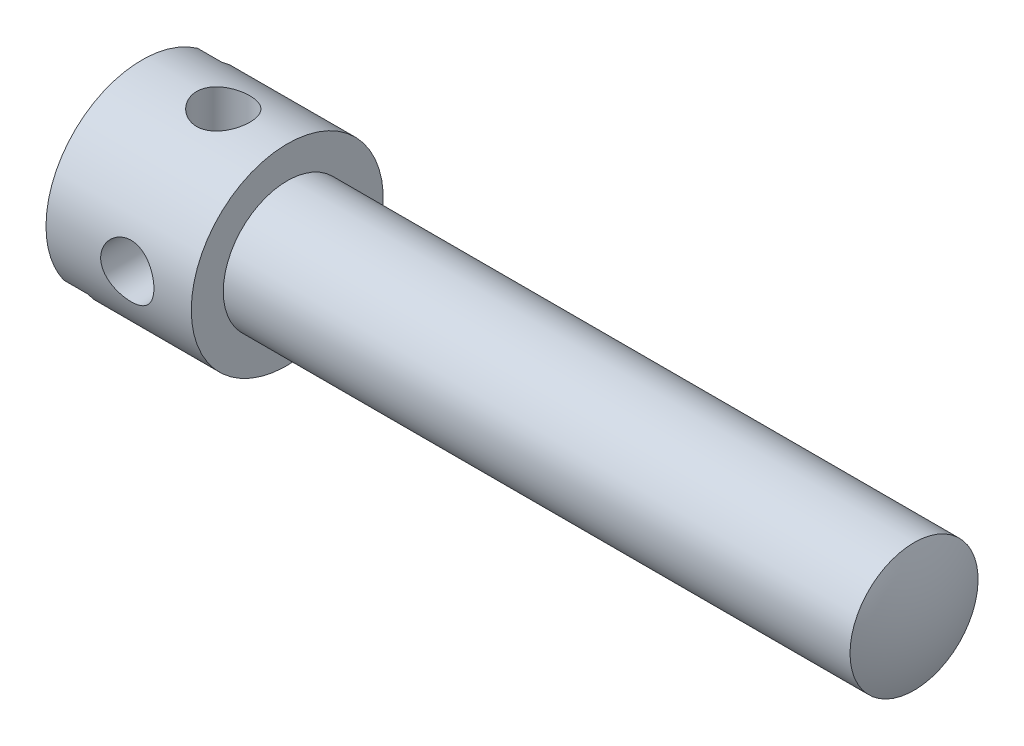
ISO-10303-21;
HEADER;
FILE_DESCRIPTION(('STEP AP214'),'2;1');
FILE_NAME('part.step','',(''),(''),'','','');
FILE_SCHEMA(('AUTOMOTIVE_DESIGN { 1 0 10303 214 1 1 1 1 }'));
ENDSEC;
DATA;
#1=APPLICATION_CONTEXT('core data for automotive mechanical design processes');
#2=APPLICATION_PROTOCOL_DEFINITION('international standard','automotive_design',2000,#1);
#3=PRODUCT_CONTEXT('',#1,'mechanical');
#4=PRODUCT('Part','Part','',(#3));
#5=PRODUCT_RELATED_PRODUCT_CATEGORY('part','',(#4));
#6=PRODUCT_DEFINITION_FORMATION('','',#4);
#7=PRODUCT_DEFINITION_CONTEXT('part definition',#1,'design');
#8=PRODUCT_DEFINITION('design','',#6,#7);
#9=PRODUCT_DEFINITION_SHAPE('','',#8);
#10=(LENGTH_UNIT() NAMED_UNIT(*) SI_UNIT(.MILLI.,.METRE.));
#11=(NAMED_UNIT(*) PLANE_ANGLE_UNIT() SI_UNIT($,.RADIAN.));
#12=(NAMED_UNIT(*) SI_UNIT($,.STERADIAN.) SOLID_ANGLE_UNIT());
#13=UNCERTAINTY_MEASURE_WITH_UNIT(LENGTH_MEASURE(1.E-05),#10,'distance_accuracy_value','');
#14=(GEOMETRIC_REPRESENTATION_CONTEXT(3) GLOBAL_UNCERTAINTY_ASSIGNED_CONTEXT((#13)) GLOBAL_UNIT_ASSIGNED_CONTEXT((#10,
#11,#12)) REPRESENTATION_CONTEXT('',''));
#15=CARTESIAN_POINT('',(0.,0.,0.));
#16=DIRECTION('',(0.,0.,1.));
#17=DIRECTION('',(1.,0.,0.));
#18=AXIS2_PLACEMENT_3D('',#15,#16,#17);
#19=CARTESIAN_POINT('',(18.4412641214728,-20.6545160380885,-24.3161484121018));
#20=DIRECTION('',(-1.,0.,0.));
#21=DIRECTION('',(0.,1.,0.));
#22=AXIS2_PLACEMENT_3D('',#19,#20,#21);
#23=SPHERICAL_SURFACE('',#22,25.);
#24=CARTESIAN_POINT('',(-5.40721591395087,-20.6545160380885,-24.3161484121018));
#25=DIRECTION('',(-1.,0.,0.));
#26=DIRECTION('',(0.,0.,1.));
#27=AXIS2_PLACEMENT_3D('',#24,#25,#26);
#28=CIRCLE('',#27,7.5);
#29=CARTESIAN_POINT('',(-5.40721591395087,-24.9997577274433,-18.2031397697807));
#30=VERTEX_POINT('',#29);
#31=CARTESIAN_POINT('',(-5.40721591395087,-14.5415073957673,-28.6613901014566));
#32=VERTEX_POINT('',#31);
#33=EDGE_CURVE('E157',#30,#32,#28,.T.);
#34=ORIENTED_EDGE('',*,*,#33,.T.);
#35=CARTESIAN_POINT('',(18.4412641214728,-19.7706325616053,-23.4322649356187));
#36=DIRECTION('',(0.,0.707106781186546,0.707106781186549));
#37=DIRECTION('',(0.,-0.707106781186549,0.707106781186546));
#38=AXIS2_PLACEMENT_3D('',#35,#36,#37);
#39=CIRCLE('',#38,24.9687304442977);
#40=EDGE_CURVE('E183',#32,#30,#39,.T.);
#41=ORIENTED_EDGE('',*,*,#40,.T.);
#42=EDGE_LOOP('',(#34,#41));
#43=FACE_BOUND('',#42,.T.);
#44=ADVANCED_FACE('F16',(#43),#23,.T.);
#45=CARTESIAN_POINT('',(0.941264121472774,-20.6545160380885,-94.3161484121019));
#46=DIRECTION('',(0.,0.,1.));
#47=DIRECTION('',(1.,0.,0.));
#48=AXIS2_PLACEMENT_3D('',#45,#46,#47);
#49=CYLINDRICAL_SURFACE('',#48,2.08);
#50=CARTESIAN_POINT('',(3.02126412147278,-20.6545160380885,-16.8161484121018));
#51=CARTESIAN_POINT('',(3.02126177590004,-20.7690086236511,-16.8161499515265));
#52=CARTESIAN_POINT('',(3.01177923896114,-20.8835257379495,-16.8187957006833));
#53=CARTESIAN_POINT('',(2.97417376740308,-21.109249871873,-16.829092733525));
#54=CARTESIAN_POINT('',(2.94604292402895,-21.2204554661633,-16.8367461409421));
#55=CARTESIAN_POINT('',(2.87213416634286,-21.43626654836,-16.856215630163));
#56=CARTESIAN_POINT('',(2.82638003298838,-21.5408807103721,-16.8680261005619));
#57=CARTESIAN_POINT('',(2.71861457996792,-21.7409514290536,-16.8945679722853));
#58=CARTESIAN_POINT('',(2.65660183134148,-21.8364071797877,-16.9092996303235));
#59=CARTESIAN_POINT('',(2.51644964772598,-22.0178288684621,-16.9405095366327));
#60=CARTESIAN_POINT('',(2.43798001518153,-22.1035342610594,-16.9570195228972));
#61=CARTESIAN_POINT('',(2.2678466998338,-22.2607532444289,-16.9897260938316));
#62=CARTESIAN_POINT('',(2.17618117061734,-22.3322648458228,-17.0059226342826));
#63=CARTESIAN_POINT('',(1.98014013481642,-22.4603673345642,-17.0364964543352));
#64=CARTESIAN_POINT('',(1.87555831451246,-22.5166528851236,-17.0508338690581));
#65=CARTESIAN_POINT('',(1.65795325101979,-22.6107367006983,-17.0755970401217));
#66=CARTESIAN_POINT('',(1.54493171186035,-22.6485386860835,-17.0860235835436));
#67=CARTESIAN_POINT('',(1.31655399339066,-22.7036667304692,-17.1014558504845));
#68=CARTESIAN_POINT('',(1.2013211455622,-22.7214677032227,-17.106587056268));
#69=CARTESIAN_POINT('',(0.96939921570726,-22.7375698314153,-17.1112221012764));
#70=CARTESIAN_POINT('',(0.852710434860466,-22.7358749551596,-17.1107270856972));
#71=CARTESIAN_POINT('',(0.624942367606029,-22.7134092831929,-17.1042775930327));
#72=CARTESIAN_POINT('',(0.513800335441755,-22.6932192334796,-17.0984893325936));
#73=CARTESIAN_POINT('',(0.296546795613579,-22.6352689830067,-17.082372533008));
#74=CARTESIAN_POINT('',(0.190435720001149,-22.5975072762186,-17.0720436046949));
#75=CARTESIAN_POINT('',(-0.0152286417802784,-22.5050266552738,-17.0478673473454));
#76=CARTESIAN_POINT('',(-0.114687503236666,-22.4501088973334,-17.0339791228886));
#77=CARTESIAN_POINT('',(-0.303179236937562,-22.325013616789,-17.0042703848697));
#78=CARTESIAN_POINT('',(-0.392209901172212,-22.2548328714368,-16.9884494635323));
#79=CARTESIAN_POINT('',(-0.560628897515607,-22.0982605600354,-16.9559715026925));
#80=CARTESIAN_POINT('',(-0.639564229408043,-22.0113830137847,-16.9393046923917));
#81=CARTESIAN_POINT('',(-0.781842002837752,-21.8254182337483,-16.9075133429213));
#82=CARTESIAN_POINT('',(-0.845183726460598,-21.7263304381296,-16.8923888747783));
#83=CARTESIAN_POINT('',(-0.954698486105356,-21.5180190640235,-16.8652803376592));
#84=CARTESIAN_POINT('',(-1.00078386926216,-21.4087471678016,-16.8533123905577));
#85=CARTESIAN_POINT('',(-1.07379647898204,-21.1835976532909,-16.8339816430555));
#86=CARTESIAN_POINT('',(-1.10072824560017,-21.0677216074476,-16.8266177513881));
#87=CARTESIAN_POINT('',(-1.13394470949133,-20.8365144188756,-16.8174922098312));
#88=CARTESIAN_POINT('',(-1.14084466715134,-20.7212781202203,-16.8155636735829));
#89=CARTESIAN_POINT('',(-1.13550858144867,-20.49129287593,-16.8170433117953));
#90=CARTESIAN_POINT('',(-1.12327469059708,-20.376543876931,-16.8204508859568));
#91=CARTESIAN_POINT('',(-1.08052086712382,-20.1530253886565,-16.8321115698254));
#92=CARTESIAN_POINT('',(-1.05034914548997,-20.0441840317668,-16.8402723500504));
#93=CARTESIAN_POINT('',(-0.972984959854057,-19.8331220520663,-16.8605087879622));
#94=CARTESIAN_POINT('',(-0.92579057924099,-19.7309021763089,-16.872584886466));
#95=CARTESIAN_POINT('',(-0.81461337802237,-19.5336329625004,-16.8996972389499));
#96=CARTESIAN_POINT('',(-0.750302508580325,-19.4387764319528,-16.9147897181063));
#97=CARTESIAN_POINT('',(-0.607125872691986,-19.2609873415236,-16.9461930504006));
#98=CARTESIAN_POINT('',(-0.528256989500167,-19.1780573417865,-16.9625041639916));
#99=CARTESIAN_POINT('',(-0.355324216074324,-19.0238457430361,-16.9951289235312));
#100=CARTESIAN_POINT('',(-0.260868357565123,-18.9529996110393,-17.0114272920354));
#101=CARTESIAN_POINT('',(-0.0610597553747219,-18.8281475215476,-17.0416367735864));
#102=CARTESIAN_POINT('',(0.0442925695019124,-18.7741409171473,-17.0555479783288));
#103=CARTESIAN_POINT('',(0.262421508213741,-18.684902820603,-17.0792459676892));
#104=CARTESIAN_POINT('',(0.375152779130467,-18.6495669044151,-17.0890556262014));
#105=CARTESIAN_POINT('',(0.605279295419787,-18.5984526739112,-17.103428959453));
#106=CARTESIAN_POINT('',(0.722673218786488,-18.5826688562524,-17.1079941103413));
#107=CARTESIAN_POINT('',(0.954315012126939,-18.5714419679624,-17.111231226315));
#108=CARTESIAN_POINT('',(1.0685264637457,-18.5752961091754,-17.1101068152461));
#109=CARTESIAN_POINT('',(1.29460262444287,-18.6015909032817,-17.1025722182843));
#110=CARTESIAN_POINT('',(1.40646740344937,-18.6240310015263,-17.0961621901265));
#111=CARTESIAN_POINT('',(1.62370916815238,-18.6864382979099,-17.0789047458977));
#112=CARTESIAN_POINT('',(1.72913568522314,-18.726245122869,-17.0680979916089));
#113=CARTESIAN_POINT('',(1.93189563853875,-18.8221318516948,-17.0432665893176));
#114=CARTESIAN_POINT('',(2.02922770969266,-18.8782144932717,-17.0292414000341));
#115=CARTESIAN_POINT('',(2.2163620842298,-19.0071422773394,-16.9989994505238));
#116=CARTESIAN_POINT('',(2.30582887745986,-19.0804614776606,-16.9827274056449));
#117=CARTESIAN_POINT('',(2.47141723692376,-19.2408945038974,-16.9501207367929));
#118=CARTESIAN_POINT('',(2.5475354921062,-19.3280117421913,-16.9337860983175));
#119=CARTESIAN_POINT('',(2.68604836463978,-19.516059145628,-16.9024311525418));
#120=CARTESIAN_POINT('',(2.74807481842464,-19.617267832795,-16.8874511889928));
#121=CARTESIAN_POINT('',(2.85413710561393,-19.8290905385424,-16.8609467267677));
#122=CARTESIAN_POINT('',(2.89818354692715,-19.9396989647544,-16.8494201916971));
#123=CARTESIAN_POINT('',(2.9618345955532,-20.1505341481245,-16.8324652621201));
#124=CARTESIAN_POINT('',(2.98406635965395,-20.2499235410374,-16.8263928185065));
#125=CARTESIAN_POINT('',(3.01378130077447,-20.4510410284306,-16.8182339429966));
#126=CARTESIAN_POINT('',(3.02126620593472,-20.5527688474641,-16.8161470440471));
#127=CARTESIAN_POINT('',(3.02126412147278,-20.6545160380885,-16.8161484121018));
#128=B_SPLINE_CURVE_WITH_KNOTS('',3,(#50,#51,#52,#53,#54,#55,#56,#57,#58,#59,#60,#61,#62,#63,
#64,#65,#66,#67,#68,#69,#70,#71,#72,#73,#74,#75,#76,#77,#78,#79,#80,#81,#82,#83,#84,#85,#86,#87,
#88,#89,#90,#91,#92,#93,#94,#95,#96,#97,#98,#99,#100,#101,#102,#103,#104,#105,#106,#107,#108,
#109,#110,#111,#112,#113,#114,#115,#116,#117,#118,#119,#120,#121,#122,#123,#124,#125,#126,#127),
.UNSPECIFIED.,.T.,.F.,(4,2,2,2,2,2,2,2,2,2,2,2,2,2,2,2,2,2,2,2,2,2,2,2,2,2,2,2,2,2,2,2,2,2,2,2,
2,2,4),(0.,0.34310443908677,0.686354482087734,1.02914295531318,1.37196156612794,
1.72246124768001,2.07301002005284,2.43014019625182,2.78719845970775,3.13558652051187,
3.48390366951812,3.82164520402484,4.15941569095652,4.50125615500133,4.84316886814917,
5.19718726379688,5.55122195505748,5.90703131178064,6.2627563015151,6.60743352062554,
6.952071967182,7.29022919864282,7.62842451571002,7.973637587138,8.31892465161763,
8.67480584923735,9.0306733736791,9.38452890097728,9.73828480566868,10.0794716415118,
10.420648295904,10.7587389182021,11.0968864427835,11.4457287596568,11.7946574834541,
12.1518590086101,12.5088494851444,12.8137950351805,13.1187048474299),.UNSPECIFIED.);
#129=CARTESIAN_POINT('',(3.02126412147278,-20.6545160380885,-16.8161484121018));
#130=VERTEX_POINT('',#129);
#131=EDGE_CURVE('E105',#130,#130,#128,.T.);
#132=ORIENTED_EDGE('',*,*,#131,.F.);
#133=EDGE_LOOP('',(#132));
#134=FACE_BOUND('',#133,.T.);
#135=CARTESIAN_POINT('',(0.941264121472774,-20.6545160380885,-24.3161484121018));
#136=DIRECTION('',(0.,-0.707106781186547,0.707106781186547));
#137=DIRECTION('',(0.,0.707106781186547,0.707106781186547));
#138=AXIS2_PLACEMENT_3D('',#135,#136,#137);
#139=ELLIPSE('',#138,2.94156420973604,2.08);
#140=CARTESIAN_POINT('',(-1.13873587852723,-20.6545160380885,-24.3161484121018));
#141=VERTEX_POINT('',#140);
#142=CARTESIAN_POINT('',(3.02126412147278,-20.6545160380885,-24.3161484121018));
#143=VERTEX_POINT('',#142);
#144=EDGE_CURVE('E36',#141,#143,#139,.F.);
#145=ORIENTED_EDGE('',*,*,#144,.T.);
#146=CARTESIAN_POINT('',(0.941264121472774,-20.6545160380885,-24.3161484121018));
#147=DIRECTION('',(0.,0.707106781186547,0.707106781186547));
#148=DIRECTION('',(0.,-0.707106781186547,0.707106781186547));
#149=AXIS2_PLACEMENT_3D('',#146,#147,#148);
#150=ELLIPSE('',#149,2.94156420973604,2.08);
#151=EDGE_CURVE('E93',#143,#141,#150,.F.);
#152=ORIENTED_EDGE('',*,*,#151,.T.);
#153=EDGE_LOOP('',(#145,#152));
#154=FACE_BOUND('',#153,.T.);
#155=ADVANCED_FACE('F130',(#134,#154),#49,.F.);
#156=CARTESIAN_POINT('',(5.94126412147277,-13.1545160380885,-24.3161484121018));
#157=DIRECTION('',(-1.,0.,0.));
#158=DIRECTION('',(0.,0.,1.));
#159=AXIS2_PLACEMENT_3D('',#156,#157,#158);
#160=PLANE('',#159);
#161=CARTESIAN_POINT('',(5.94126412147277,-20.6545160380885,-24.3161484121018));
#162=DIRECTION('',(-1.,0.,0.));
#163=DIRECTION('',(0.,0.,1.));
#164=AXIS2_PLACEMENT_3D('',#161,#162,#163);
#165=CIRCLE('',#164,7.5);
#166=CARTESIAN_POINT('',(5.94126412147277,-20.6545160380885,-16.8161484121018));
#167=VERTEX_POINT('',#166);
#168=EDGE_CURVE('E158',#167,#167,#165,.T.);
#169=ORIENTED_EDGE('',*,*,#168,.F.);
#170=EDGE_LOOP('',(#169));
#171=FACE_BOUND('',#170,.T.);
#172=CARTESIAN_POINT('',(5.94126412147277,-20.6545160380885,-24.3161484121018));
#173=DIRECTION('',(-1.,0.,0.));
#174=DIRECTION('',(0.,0.,1.));
#175=AXIS2_PLACEMENT_3D('',#172,#173,#174);
#176=CIRCLE('',#175,5.);
#177=CARTESIAN_POINT('',(5.94126412147277,-20.6545160380885,-19.3161484121018));
#178=VERTEX_POINT('',#177);
#179=EDGE_CURVE('E101',#178,#178,#176,.F.);
#180=ORIENTED_EDGE('',*,*,#179,.F.);
#181=EDGE_LOOP('',(#180));
#182=FACE_BOUND('',#181,.T.);
#183=ADVANCED_FACE('F146',(#171,#182),#160,.F.);
#184=CARTESIAN_POINT('',(-5.40721591395087,-16.3092743487337,-30.429157054423));
#185=VERTEX_POINT('',#184);
#186=CARTESIAN_POINT('',(-5.40721591395087,-26.7675246804096,-19.9709067227471));
#187=VERTEX_POINT('',#186);
#188=EDGE_CURVE('E160',#185,#187,#28,.T.);
#189=ORIENTED_EDGE('',*,*,#188,.T.);
#190=CARTESIAN_POINT('',(18.4412641214728,-21.5383995145717,-25.200031888585));
#191=DIRECTION('',(0.,-0.707106781186546,-0.707106781186549));
#192=DIRECTION('',(0.,0.707106781186549,-0.707106781186546));
#193=AXIS2_PLACEMENT_3D('',#190,#191,#192);
#194=CIRCLE('',#193,24.9687304442977);
#195=EDGE_CURVE('E67',#187,#185,#194,.T.);
#196=ORIENTED_EDGE('',*,*,#195,.T.);
#197=EDGE_LOOP('',(#189,#196));
#198=FACE_BOUND('',#197,.T.);
#199=ADVANCED_FACE('F18',(#198),#23,.T.);
#200=CARTESIAN_POINT('',(-31.6182793740149,-20.6545160380885,-24.3161484121018));
#201=DIRECTION('',(-1.,0.,0.));
#202=DIRECTION('',(0.,0.,1.));
#203=AXIS2_PLACEMENT_3D('',#200,#201,#202);
#204=CYLINDRICAL_SURFACE('',#203,7.5);
#205=CARTESIAN_POINT('',(0.941264121472774,-27.8603192549409,-22.2361484121018));
#206=CARTESIAN_POINT('',(1.05566117933701,-27.8603210464082,-22.2361507999992));
#207=CARTESIAN_POINT('',(1.17008284070807,-27.8630732471144,-22.2456180703913));
#208=CARTESIAN_POINT('',(1.39560909584565,-27.8737484245418,-22.2831574150593));
#209=CARTESIAN_POINT('',(1.50671217728147,-27.8816737222352,-22.3112378404388));
#210=CARTESIAN_POINT('',(1.72230564641116,-27.9017299881532,-22.3849993002082));
#211=CARTESIAN_POINT('',(1.82680558303251,-27.9138547109236,-22.4306542087086));
#212=CARTESIAN_POINT('',(2.02668225604302,-27.9409355692136,-22.5381854679922));
#213=CARTESIAN_POINT('',(2.12205807330961,-27.9558919895344,-22.6000634506711));
#214=CARTESIAN_POINT('',(2.30355870742098,-27.9874044707085,-22.7400747643598));
#215=CARTESIAN_POINT('',(2.38940019955647,-28.0039907093889,-22.8185686636573));
#216=CARTESIAN_POINT('',(2.54688505605188,-28.0366343523105,-22.9888090275393));
#217=CARTESIAN_POINT('',(2.618526845203,-28.0526916977157,-23.0805569604776));
#218=CARTESIAN_POINT('',(2.74677509186661,-28.0828069519525,-23.2766813293211));
#219=CARTESIAN_POINT('',(2.80309765337812,-28.0968251228101,-23.3812500415443));
#220=CARTESIAN_POINT('',(2.8972533859007,-28.1209349645656,-23.5988273364844));
#221=CARTESIAN_POINT('',(2.935089939696,-28.1310273537798,-23.7118343706927));
#222=CARTESIAN_POINT('',(2.99027630158769,-28.145935067615,-23.940120915101));
#223=CARTESIAN_POINT('',(3.00810858813764,-28.1508744602808,-24.0552755448787));
#224=CARTESIAN_POINT('',(3.02430053853173,-28.1553543989889,-24.2870408441641));
#225=CARTESIAN_POINT('',(3.02266371707159,-28.1548959194919,-24.4036512470688));
#226=CARTESIAN_POINT('',(3.00029879122044,-28.1487216936719,-24.6316515734435));
#227=CARTESIAN_POINT('',(2.98009231692028,-28.143149597117,-24.7430971539727));
#228=CARTESIAN_POINT('',(2.92200726225969,-28.1275452786644,-24.9609488355043));
#229=CARTESIAN_POINT('',(2.88412763512805,-28.117512792582,-25.0673546375921));
#230=CARTESIAN_POINT('',(2.79138635682296,-28.0939063689906,-25.2734094975545));
#231=CARTESIAN_POINT('',(2.73635055634143,-28.0802963493838,-25.3729758704404));
#232=CARTESIAN_POINT('',(2.61099402864518,-28.0509944038345,-25.5616345115424));
#233=CARTESIAN_POINT('',(2.54067011503078,-28.0353020441497,-25.6507245902806));
#234=CARTESIAN_POINT('',(2.38398362639406,-28.002916095721,-25.8190158621122));
#235=CARTESIAN_POINT('',(2.29716687375616,-27.9862065601576,-25.8977916457778));
#236=CARTESIAN_POINT('',(2.11138438113874,-27.9541341472101,-26.0397748713823));
#237=CARTESIAN_POINT('',(2.01241777067519,-27.9387713664505,-26.1029811968613));
#238=CARTESIAN_POINT('',(1.80416229946709,-27.9110638584078,-26.2123909950915));
#239=CARTESIAN_POINT('',(1.69480477754352,-27.8987414652464,-26.2584698340055));
#240=CARTESIAN_POINT('',(1.46946618999995,-27.8787827384557,-26.3314444038327));
#241=CARTESIAN_POINT('',(1.35348693191168,-27.8711451326443,-26.3583453429418));
#242=CARTESIAN_POINT('',(1.12219763587391,-27.8616943503105,-26.3914483013937));
#243=CARTESIAN_POINT('',(1.00698619965338,-27.8597016256164,-26.3982886513078));
#244=CARTESIAN_POINT('',(0.777063877562746,-27.8612733434615,-26.3928423907507));
#245=CARTESIAN_POINT('',(0.662352934979843,-27.8648371390592,-26.380558006958));
#246=CARTESIAN_POINT('',(0.439208605354852,-27.8769460281497,-26.3377756135015));
#247=CARTESIAN_POINT('',(0.330693662568094,-27.8853838173238,-26.3076696155049));
#248=CARTESIAN_POINT('',(0.120255911514821,-27.9061831715335,-26.2305435565121));
#249=CARTESIAN_POINT('',(0.0183340171860929,-27.9185452791666,-26.1835211564429));
#250=CARTESIAN_POINT('',(-0.178672188382507,-27.9461625774618,-26.0726277292787));
#251=CARTESIAN_POINT('',(-0.273539288880627,-27.9614789765413,-26.0083864240276));
#252=CARTESIAN_POINT('',(-0.451381015323776,-27.993139053141,-25.8653317050955));
#253=CARTESIAN_POINT('',(-0.53435321065149,-28.0094829396404,-25.7865153206408));
#254=CARTESIAN_POINT('',(-0.688743113072735,-28.0419810170775,-25.6135800471647));
#255=CARTESIAN_POINT('',(-0.759713338759371,-28.0581129291673,-25.5190566049951));
#256=CARTESIAN_POINT('',(-0.884784049158068,-28.0878430129729,-25.3190711736581));
#257=CARTESIAN_POINT('',(-0.938885428166581,-28.1014413189917,-25.2136097647587));
#258=CARTESIAN_POINT('',(-1.02817340122742,-28.1244845574552,-24.9954813571623));
#259=CARTESIAN_POINT('',(-1.0635028550367,-28.1339607570239,-24.8828763012321));
#260=CARTESIAN_POINT('',(-1.11464651924871,-28.1478300067621,-24.6530229203749));
#261=CARTESIAN_POINT('',(-1.1304654361669,-28.1522242828251,-24.5357757223154));
#262=CARTESIAN_POINT('',(-1.14182432191591,-28.1553714694691,-24.304132176584));
#263=CARTESIAN_POINT('',(-1.13801822589585,-28.1543063041077,-24.1897699314786));
#264=CARTESIAN_POINT('',(-1.11176732518427,-28.1470710620021,-23.9633789950965));
#265=CARTESIAN_POINT('',(-1.08932332465659,-28.1409012055085,-23.8513502033528));
#266=CARTESIAN_POINT('',(-1.0268151563255,-28.124191026326,-23.6336606116456));
#267=CARTESIAN_POINT('',(-0.986893191809018,-28.1136860138981,-23.5279560870941));
#268=CARTESIAN_POINT('',(-0.890688831097136,-28.0893995473426,-23.324686054277));
#269=CARTESIAN_POINT('',(-0.83440400294118,-28.0756176062309,-23.2271217586439));
#270=CARTESIAN_POINT('',(-0.705211486805817,-28.0457561192058,-23.0398965589888));
#271=CARTESIAN_POINT('',(-0.631877243137491,-28.0296224526732,-22.9505386661289));
#272=CARTESIAN_POINT('',(-0.471463831240127,-27.997079805512,-22.7851766518985));
#273=CARTESIAN_POINT('',(-0.384380951499222,-27.9806707516134,-22.7091761481621));
#274=CARTESIAN_POINT('',(-0.196395396120463,-27.9489722970451,-22.5708470775932));
#275=CARTESIAN_POINT('',(-0.0952080873440581,-27.9337198400755,-22.5088960397368));
#276=CARTESIAN_POINT('',(0.11655639816615,-27.9066022941958,-22.4029694547559));
#277=CARTESIAN_POINT('',(0.227127867166753,-27.8947351651143,-22.3589830742813));
#278=CARTESIAN_POINT('',(0.437821154300105,-27.8772367266454,-22.2954499369104));
#279=CARTESIAN_POINT('',(0.537100570458857,-27.8709465444373,-22.2732667359032));
#280=CARTESIAN_POINT('',(0.738001772485113,-27.8624872948262,-22.2436159199808));
#281=CARTESIAN_POINT('',(0.839623235750087,-27.8603176632362,-22.2361462904738));
#282=CARTESIAN_POINT('',(0.941264121472774,-27.8603192549409,-22.2361484121018));
#283=B_SPLINE_CURVE_WITH_KNOTS('',3,(#205,#206,#207,#208,#209,#210,#211,#212,#213,#214,#215,
#216,#217,#218,#219,#220,#221,#222,#223,#224,#225,#226,#227,#228,#229,#230,#231,#232,#233,#234,
#235,#236,#237,#238,#239,#240,#241,#242,#243,#244,#245,#246,#247,#248,#249,#250,#251,#252,#253,
#254,#255,#256,#257,#258,#259,#260,#261,#262,#263,#264,#265,#266,#267,#268,#269,#270,#271,#272,
#273,#274,#275,#276,#277,#278,#279,#280,#281,#282),.UNSPECIFIED.,.T.,.F.,(4,2,2,2,2,2,2,2,2,2,2,
2,2,2,2,2,2,2,2,2,2,2,2,2,2,2,2,2,2,2,2,2,2,2,2,2,2,2,4),(0.,0.34281707278771,0.685788060399508,
1.02825115070458,1.37074870294792,1.72162331927668,2.07253683725146,2.42956807966102,
2.78653396385731,3.1346916189637,3.48278642323748,3.82139242840839,4.16001849157496,
4.50220042724101,4.84445375010324,5.19804604805,5.55166369413481,5.90780639210291,
6.26385233451877,6.60843890396125,6.95298535644801,7.29022077209699,7.62750283606283,
7.97271802278422,8.31800365089472,8.6741901670784,9.03035779693719,9.38377459181067,
9.73710611547109,10.0787417533301,10.4203626515088,10.7592542775902,11.0981962978328,
11.4467608271354,11.7954196145478,12.1525593098776,12.509483317679,12.8141153025317,
13.1187055740783),.UNSPECIFIED.);
#284=CARTESIAN_POINT('',(0.941264121472774,-27.8603192549409,-22.2361484121018));
#285=VERTEX_POINT('',#284);
#286=EDGE_CURVE('E164',#285,#285,#283,.T.);
#287=ORIENTED_EDGE('',*,*,#286,.T.);
#288=EDGE_LOOP('',(#287));
#289=FACE_BOUND('',#288,.T.);
#290=CARTESIAN_POINT('',(0.941264121472774,-13.4487128212361,-22.2361484121018));
#291=CARTESIAN_POINT('',(0.826867063608539,-13.4487110297688,-22.2361507999992));
#292=CARTESIAN_POINT('',(0.712445402237482,-13.4459588290626,-22.2456180703913));
#293=CARTESIAN_POINT('',(0.486919147099901,-13.4352836516352,-22.2831574150593));
#294=CARTESIAN_POINT('',(0.375816065664081,-13.4273583539418,-22.3112378404388));
#295=CARTESIAN_POINT('',(0.160222596534389,-13.4073020880237,-22.3849993002082));
#296=CARTESIAN_POINT('',(0.0557226599130397,-13.3951773652533,-22.4306542087086));
#297=CARTESIAN_POINT('',(-0.144154013097473,-13.3680965069634,-22.5381854679922));
#298=CARTESIAN_POINT('',(-0.239529830364061,-13.3531400866426,-22.6000634506711));
#299=CARTESIAN_POINT('',(-0.421030464475433,-13.3216276054685,-22.7400747643598));
#300=CARTESIAN_POINT('',(-0.506871956610924,-13.3050413667881,-22.8185686636573));
#301=CARTESIAN_POINT('',(-0.664356813106329,-13.2723977238665,-22.9888090275393));
#302=CARTESIAN_POINT('',(-0.735998602257455,-13.2563403784613,-23.0805569604776));
#303=CARTESIAN_POINT('',(-0.864246848921057,-13.2262251242245,-23.2766813293211));
#304=CARTESIAN_POINT('',(-0.920569410432573,-13.2122069533669,-23.3812500415443));
#305=CARTESIAN_POINT('',(-1.01472514295516,-13.1880971116113,-23.5988273364844));
#306=CARTESIAN_POINT('',(-1.05256169675045,-13.1780047223972,-23.7118343706927));
#307=CARTESIAN_POINT('',(-1.10774805864214,-13.163097008562,-23.940120915101));
#308=CARTESIAN_POINT('',(-1.12558034519209,-13.1581576158961,-24.0552755448787));
#309=CARTESIAN_POINT('',(-1.14177229558618,-13.153677677188,-24.2870408441641));
#310=CARTESIAN_POINT('',(-1.14013547412605,-13.1541361566851,-24.4036512470688));
#311=CARTESIAN_POINT('',(-1.11777054827489,-13.1603103825051,-24.6316515734435));
#312=CARTESIAN_POINT('',(-1.09756407397474,-13.16588247906,-24.7430971539727));
#313=CARTESIAN_POINT('',(-1.03947901931415,-13.1814867975125,-24.9609488355043));
#314=CARTESIAN_POINT('',(-1.0015993921825,-13.1915192835949,-25.0673546375921));
#315=CARTESIAN_POINT('',(-0.908858113877414,-13.2151257071863,-25.2734094975545));
#316=CARTESIAN_POINT('',(-0.853822313395882,-13.2287357267931,-25.3729758704404));
#317=CARTESIAN_POINT('',(-0.728465785699636,-13.2580376723425,-25.5616345115424));
#318=CARTESIAN_POINT('',(-0.658141872085235,-13.2737300320273,-25.6507245902806));
#319=CARTESIAN_POINT('',(-0.501455383448517,-13.3061159804559,-25.8190158621122));
#320=CARTESIAN_POINT('',(-0.41463863081061,-13.3228255160194,-25.8977916457778));
#321=CARTESIAN_POINT('',(-0.228856138193188,-13.3548979289668,-26.0397748713823));
#322=CARTESIAN_POINT('',(-0.129889527729639,-13.3702607097265,-26.1029811968613));
#323=CARTESIAN_POINT('',(0.078365943478454,-13.3979682177692,-26.2123909950915));
#324=CARTESIAN_POINT('',(0.187723465402031,-13.4102906109306,-26.2584698340055));
#325=CARTESIAN_POINT('',(0.413062052945593,-13.4302493377213,-26.3314444038327));
#326=CARTESIAN_POINT('',(0.529041311033865,-13.4378869435327,-26.3583453429418));
#327=CARTESIAN_POINT('',(0.76033060707164,-13.4473377258665,-26.3914483013937));
#328=CARTESIAN_POINT('',(0.875542043292168,-13.4493304505606,-26.3982886513078));
#329=CARTESIAN_POINT('',(1.1054643653828,-13.4477587327155,-26.3928423907507));
#330=CARTESIAN_POINT('',(1.2201753079657,-13.4441949371178,-26.380558006958));
#331=CARTESIAN_POINT('',(1.44331963759069,-13.4320860480273,-26.3377756135015));
#332=CARTESIAN_POINT('',(1.55183458037745,-13.4236482588532,-26.3076696155049));
#333=CARTESIAN_POINT('',(1.76227233143072,-13.4028489046435,-26.2305435565121));
#334=CARTESIAN_POINT('',(1.86419422575945,-13.3904867970104,-26.1835211564429));
#335=CARTESIAN_POINT('',(2.06120043132805,-13.3628694987152,-26.0726277292787));
#336=CARTESIAN_POINT('',(2.15606753182617,-13.3475530996356,-26.0083864240276));
#337=CARTESIAN_POINT('',(2.33390925826932,-13.3158930230359,-25.8653317050955));
#338=CARTESIAN_POINT('',(2.41688145359704,-13.2995491365366,-25.7865153206408));
#339=CARTESIAN_POINT('',(2.57127135601828,-13.2670510590994,-25.6135800471647));
#340=CARTESIAN_POINT('',(2.64224158170492,-13.2509191470096,-25.5190566049951));
#341=CARTESIAN_POINT('',(2.76731229210362,-13.221189063204,-25.3190711736581));
#342=CARTESIAN_POINT('',(2.82141367111213,-13.2075907571853,-25.2136097647588));
#343=CARTESIAN_POINT('',(2.91070164417297,-13.1845475187217,-24.9954813571623));
#344=CARTESIAN_POINT('',(2.94603109798225,-13.175071319153,-24.8828763012321));
#345=CARTESIAN_POINT('',(2.99717476219426,-13.1612020694148,-24.6530229203749));
#346=CARTESIAN_POINT('',(3.01299367911245,-13.1568077933518,-24.5357757223154));
#347=CARTESIAN_POINT('',(3.02435256486146,-13.1536606067079,-24.304132176584));
#348=CARTESIAN_POINT('',(3.02054646884139,-13.1547257720692,-24.1897699314786));
#349=CARTESIAN_POINT('',(2.99429556812982,-13.1619610141748,-23.9633789950965));
#350=CARTESIAN_POINT('',(2.97185156760214,-13.1681308706685,-23.8513502033528));
#351=CARTESIAN_POINT('',(2.90934339927105,-13.1848410498509,-23.6336606116456));
#352=CARTESIAN_POINT('',(2.86942143475457,-13.1953460622789,-23.5279560870941));
#353=CARTESIAN_POINT('',(2.77321707404268,-13.2196325288344,-23.324686054277));
#354=CARTESIAN_POINT('',(2.71693224588673,-13.2334144699461,-23.2271217586439));
#355=CARTESIAN_POINT('',(2.58773972975137,-13.2632759569711,-23.0398965589888));
#356=CARTESIAN_POINT('',(2.51440548608304,-13.2794096235038,-22.9505386661289));
#357=CARTESIAN_POINT('',(2.35399207418568,-13.3119522706649,-22.7851766518985));
#358=CARTESIAN_POINT('',(2.26690919444477,-13.3283613245635,-22.7091761481621));
#359=CARTESIAN_POINT('',(2.07892363906601,-13.3600597791319,-22.5708470775932));
#360=CARTESIAN_POINT('',(1.97773633028961,-13.3753122361015,-22.5088960397368));
#361=CARTESIAN_POINT('',(1.7659718447794,-13.4024297819811,-22.4029694547559));
#362=CARTESIAN_POINT('',(1.6554003757788,-13.4142969110627,-22.3589830742813));
#363=CARTESIAN_POINT('',(1.44470708864545,-13.4317953495316,-22.2954499369104));
#364=CARTESIAN_POINT('',(1.34542767248669,-13.4380855317397,-22.2732667359032));
#365=CARTESIAN_POINT('',(1.14452647046044,-13.4465447813508,-22.2436159199808));
#366=CARTESIAN_POINT('',(1.04290500719546,-13.4487144129407,-22.2361462904738));
#367=CARTESIAN_POINT('',(0.941264121472774,-13.4487128212361,-22.2361484121018));
#368=B_SPLINE_CURVE_WITH_KNOTS('',3,(#290,#291,#292,#293,#294,#295,#296,#297,#298,#299,#300,
#301,#302,#303,#304,#305,#306,#307,#308,#309,#310,#311,#312,#313,#314,#315,#316,#317,#318,#319,
#320,#321,#322,#323,#324,#325,#326,#327,#328,#329,#330,#331,#332,#333,#334,#335,#336,#337,#338,
#339,#340,#341,#342,#343,#344,#345,#346,#347,#348,#349,#350,#351,#352,#353,#354,#355,#356,#357,
#358,#359,#360,#361,#362,#363,#364,#365,#366,#367),.UNSPECIFIED.,.T.,.F.,(4,2,2,2,2,2,2,2,2,2,2,
2,2,2,2,2,2,2,2,2,2,2,2,2,2,2,2,2,2,2,2,2,2,2,2,2,2,2,4),(0.,0.34281707278771,0.685788060399506,
1.02825115070458,1.37074870294792,1.72162331927668,2.07253683725146,2.42956807966101,
2.78653396385731,3.13469161896369,3.48278642323748,3.82139242840839,4.16001849157496,
4.50220042724101,4.84445375010323,5.19804604805,5.55166369413481,5.90780639210291,
6.26385233451877,6.60843890396125,6.95298535644801,7.29022077209699,7.62750283606283,
7.97271802278421,8.31800365089472,8.6741901670784,9.03035779693719,9.38377459181067,
9.73710611547109,10.0787417533301,10.4203626515088,10.7592542775902,11.0981962978328,
11.4467608271354,11.7954196145478,12.1525593098776,12.509483317679,12.8141153025317,
13.1187055740783),.UNSPECIFIED.);
#369=CARTESIAN_POINT('',(0.941264121472774,-13.4487128212361,-22.2361484121018));
#370=VERTEX_POINT('',#369);
#371=EDGE_CURVE('E180',#370,#370,#368,.T.);
#372=ORIENTED_EDGE('',*,*,#371,.T.);
#373=EDGE_LOOP('',(#372));
#374=FACE_BOUND('',#373,.T.);
#375=ORIENTED_EDGE('',*,*,#131,.T.);
#376=EDGE_LOOP('',(#375));
#377=FACE_BOUND('',#376,.T.);
#378=CARTESIAN_POINT('',(3.02126412147278,-20.6545160380885,-31.8161484121018));
#379=CARTESIAN_POINT('',(3.02126177590003,-20.5400234525258,-31.8161468726772));
#380=CARTESIAN_POINT('',(3.01177923896114,-20.4255063382275,-31.8135011235204));
#381=CARTESIAN_POINT('',(2.97417376740308,-20.1997822043039,-31.8032040906787));
#382=CARTESIAN_POINT('',(2.94604292402895,-20.0885766100137,-31.7955506832616));
#383=CARTESIAN_POINT('',(2.87213416634287,-19.872765527817,-31.7760811940407));
#384=CARTESIAN_POINT('',(2.82638003298838,-19.7681513658049,-31.7642707236418));
#385=CARTESIAN_POINT('',(2.71861457996792,-19.5680806471234,-31.7377288519184));
#386=CARTESIAN_POINT('',(2.65660183134149,-19.4726248963893,-31.7229971938802));
#387=CARTESIAN_POINT('',(2.51644964772598,-19.2912032077149,-31.691787287571));
#388=CARTESIAN_POINT('',(2.43798001518153,-19.2054978151176,-31.6752773013065));
#389=CARTESIAN_POINT('',(2.2678466998338,-19.0482788317481,-31.6425707303721));
#390=CARTESIAN_POINT('',(2.17618117061734,-18.9767672303542,-31.6263741899211));
#391=CARTESIAN_POINT('',(1.98014013481642,-18.8486647416127,-31.5958003698685));
#392=CARTESIAN_POINT('',(1.87555831451246,-18.7923791910533,-31.5814629551456));
#393=CARTESIAN_POINT('',(1.65795325101979,-18.6982953754787,-31.556699784082));
#394=CARTESIAN_POINT('',(1.54493171186035,-18.6604933900935,-31.5462732406601));
#395=CARTESIAN_POINT('',(1.31655399339066,-18.6053653457078,-31.5308409737192));
#396=CARTESIAN_POINT('',(1.2013211455622,-18.5875643729542,-31.5257097679357));
#397=CARTESIAN_POINT('',(0.96939921570726,-18.5714622447616,-31.5210747229273));
#398=CARTESIAN_POINT('',(0.852710434860466,-18.5731571210174,-31.5215697385065));
#399=CARTESIAN_POINT('',(0.624942367606029,-18.5956227929841,-31.528019231171));
#400=CARTESIAN_POINT('',(0.513800335441755,-18.6158128426974,-31.5338074916101));
#401=CARTESIAN_POINT('',(0.296546795613579,-18.6737630931703,-31.5499242911957));
#402=CARTESIAN_POINT('',(0.190435720001149,-18.7115247999584,-31.5602532195088));
#403=CARTESIAN_POINT('',(-0.0152286417802784,-18.8040054209032,-31.5844294768583));
#404=CARTESIAN_POINT('',(-0.114687503236666,-18.8589231788435,-31.5983177013151));
#405=CARTESIAN_POINT('',(-0.303179236937562,-18.9840184593879,-31.628026439334));
#406=CARTESIAN_POINT('',(-0.392209901172213,-19.0541992047401,-31.6438473606714));
#407=CARTESIAN_POINT('',(-0.560628897515607,-19.2107715161416,-31.6763253215112));
#408=CARTESIAN_POINT('',(-0.639564229408043,-19.2976490623922,-31.692992131812));
#409=CARTESIAN_POINT('',(-0.781842002837752,-19.4836138424287,-31.7247834812824));
#410=CARTESIAN_POINT('',(-0.845183726460598,-19.5827016380474,-31.7399079494254));
#411=CARTESIAN_POINT('',(-0.954698486105356,-19.7910130121535,-31.7670164865445));
#412=CARTESIAN_POINT('',(-1.00078386926216,-19.9002849083754,-31.778984433646));
#413=CARTESIAN_POINT('',(-1.07379647898204,-20.125434422886,-31.7983151811482));
#414=CARTESIAN_POINT('',(-1.10072824560017,-20.2413104687294,-31.8056790728156));
#415=CARTESIAN_POINT('',(-1.13394470949133,-20.4725176573013,-31.8148046143725));
#416=CARTESIAN_POINT('',(-1.14084466715134,-20.5877539559566,-31.8167331506208));
#417=CARTESIAN_POINT('',(-1.13550858144867,-20.817739200247,-31.8152535124084));
#418=CARTESIAN_POINT('',(-1.12327469059708,-20.932488199246,-31.8118459382469));
#419=CARTESIAN_POINT('',(-1.08052086712382,-21.1560066875205,-31.8001852543783));
#420=CARTESIAN_POINT('',(-1.05034914548997,-21.2648480444101,-31.7920244741533));
#421=CARTESIAN_POINT('',(-0.972984959854057,-21.4759100241107,-31.7717880362415));
#422=CARTESIAN_POINT('',(-0.92579057924099,-21.5781298998681,-31.7597119377377));
#423=CARTESIAN_POINT('',(-0.814613378022369,-21.7753991136766,-31.7325995852538));
#424=CARTESIAN_POINT('',(-0.750302508580324,-21.8702556442241,-31.7175071060974));
#425=CARTESIAN_POINT('',(-0.607125872691984,-22.0480447346534,-31.6861037738031));
#426=CARTESIAN_POINT('',(-0.528256989500166,-22.1309747343905,-31.6697926602121));
#427=CARTESIAN_POINT('',(-0.355324216074324,-22.2851863331409,-31.6371679006725));
#428=CARTESIAN_POINT('',(-0.260868357565125,-22.3560324651377,-31.6208695321683));
#429=CARTESIAN_POINT('',(-0.0610597553747232,-22.4808845546294,-31.5906600506173));
#430=CARTESIAN_POINT('',(0.0442925695019119,-22.5348911590297,-31.5767488458749));
#431=CARTESIAN_POINT('',(0.262421508213741,-22.624129255574,-31.5530508565145));
#432=CARTESIAN_POINT('',(0.375152779130467,-22.6594651717618,-31.5432411980023));
#433=CARTESIAN_POINT('',(0.605279295419787,-22.7105794022658,-31.5288678647507));
#434=CARTESIAN_POINT('',(0.722673218786488,-22.7263632199246,-31.5243027138624));
#435=CARTESIAN_POINT('',(0.954315012126939,-22.7375901082145,-31.5210655978887));
#436=CARTESIAN_POINT('',(1.0685264637457,-22.7337359670015,-31.5221900089576));
#437=CARTESIAN_POINT('',(1.29460262444287,-22.7074411728953,-31.5297246059194));
#438=CARTESIAN_POINT('',(1.40646740344937,-22.6850010746507,-31.5361346340772));
#439=CARTESIAN_POINT('',(1.62370916815238,-22.6225937782671,-31.553392078306));
#440=CARTESIAN_POINT('',(1.72913568522315,-22.582786953308,-31.5641988325948));
#441=CARTESIAN_POINT('',(1.93189563853875,-22.4869002244821,-31.5890302348861));
#442=CARTESIAN_POINT('',(2.02922770969266,-22.4308175829052,-31.6030554241696));
#443=CARTESIAN_POINT('',(2.2163620842298,-22.3018897988376,-31.6332973736799));
#444=CARTESIAN_POINT('',(2.30582887745986,-22.2285705985163,-31.6495694185588));
#445=CARTESIAN_POINT('',(2.47141723692376,-22.0681375722795,-31.6821760874108));
#446=CARTESIAN_POINT('',(2.5475354921062,-21.9810203339857,-31.6985107258861));
#447=CARTESIAN_POINT('',(2.68604836463978,-21.7929729305489,-31.7298656716619));
#448=CARTESIAN_POINT('',(2.74807481842464,-21.691764243382,-31.7448456352109));
#449=CARTESIAN_POINT('',(2.85413710561393,-21.4799415376346,-31.771350097436));
#450=CARTESIAN_POINT('',(2.89818354692715,-21.3693331114226,-31.7828766325066));
#451=CARTESIAN_POINT('',(2.9618345955532,-21.1584979280524,-31.7998315620836));
#452=CARTESIAN_POINT('',(2.98406635965395,-21.0591085351395,-31.8059040056972));
#453=CARTESIAN_POINT('',(3.01378130077447,-20.8579910477464,-31.8140628812071));
#454=CARTESIAN_POINT('',(3.02126620593471,-20.7562632287129,-31.8161497801566));
#455=CARTESIAN_POINT('',(3.02126412147278,-20.6545160380885,-31.8161484121018));
#456=B_SPLINE_CURVE_WITH_KNOTS('',3,(#378,#379,#380,#381,#382,#383,#384,#385,#386,#387,#388,
#389,#390,#391,#392,#393,#394,#395,#396,#397,#398,#399,#400,#401,#402,#403,#404,#405,#406,#407,
#408,#409,#410,#411,#412,#413,#414,#415,#416,#417,#418,#419,#420,#421,#422,#423,#424,#425,#426,
#427,#428,#429,#430,#431,#432,#433,#434,#435,#436,#437,#438,#439,#440,#441,#442,#443,#444,#445,
#446,#447,#448,#449,#450,#451,#452,#453,#454,#455),.UNSPECIFIED.,.T.,.F.,(4,2,2,2,2,2,2,2,2,2,2,
2,2,2,2,2,2,2,2,2,2,2,2,2,2,2,2,2,2,2,2,2,2,2,2,2,2,2,4),(0.,0.343104439086773,
0.686354482087733,1.02914295531317,1.37196156612794,1.72246124768001,2.07301002005284,
2.43014019625181,2.78719845970775,3.13558652051187,3.48390366951812,3.82164520402484,
4.15941569095652,4.50125615500133,4.84316886814917,5.19718726379688,5.55122195505748,
5.90703131178064,6.2627563015151,6.60743352062554,6.952071967182,7.29022919864282,
7.62842451571001,7.973637587138,8.31892465161763,8.67480584923734,9.03067337367909,
9.38452890097727,9.73828480566867,10.0794716415118,10.420648295904,10.7587389182021,
11.0968864427834,11.4457287596568,11.7946574834541,12.1518590086101,12.5088494851444,
12.8137950351805,13.1187048474299),.UNSPECIFIED.);
#457=CARTESIAN_POINT('',(3.02126412147278,-20.6545160380885,-31.8161484121018));
#458=VERTEX_POINT('',#457);
#459=EDGE_CURVE('E112',#458,#458,#456,.T.);
#460=ORIENTED_EDGE('',*,*,#459,.T.);
#461=EDGE_LOOP('',(#460));
#462=FACE_BOUND('',#461,.T.);
#463=ORIENTED_EDGE('',*,*,#33,.F.);
#464=DIRECTION('',(-1.,0.,0.));
#465=VECTOR('',#464,1.);
#466=CARTESIAN_POINT('',(-31.6182793740149,-24.9997577274433,-18.2031397697807));
#467=LINE('',#466,#465);
#468=CARTESIAN_POINT('',(-3.55873587852723,-24.9997577274433,-18.2031397697807));
#469=VERTEX_POINT('',#468);
#470=EDGE_CURVE('E10',#30,#469,#467,.F.);
#471=ORIENTED_EDGE('',*,*,#470,.T.);
#472=CARTESIAN_POINT('',(-3.55873587852723,-20.6545160380885,-24.3161484121018));
#473=DIRECTION('',(1.,0.,0.));
#474=DIRECTION('',(0.,0.,-1.));
#475=AXIS2_PLACEMENT_3D('',#472,#473,#474);
#476=CIRCLE('',#475,7.5);
#477=CARTESIAN_POINT('',(-3.55873587852723,-26.7675246804096,-19.9709067227471));
#478=VERTEX_POINT('',#477);
#479=EDGE_CURVE('E24',#469,#478,#476,.T.);
#480=ORIENTED_EDGE('',*,*,#479,.T.);
#481=DIRECTION('',(-1.,0.,0.));
#482=VECTOR('',#481,1.);
#483=CARTESIAN_POINT('',(-31.6182793740149,-26.7675246804096,-19.9709067227471));
#484=LINE('',#483,#482);
#485=EDGE_CURVE('E65',#478,#187,#484,.T.);
#486=ORIENTED_EDGE('',*,*,#485,.T.);
#487=ORIENTED_EDGE('',*,*,#188,.F.);
#488=DIRECTION('',(-1.,0.,0.));
#489=VECTOR('',#488,1.);
#490=CARTESIAN_POINT('',(-31.6182793740149,-16.3092743487337,-30.429157054423));
#491=LINE('',#490,#489);
#492=CARTESIAN_POINT('',(-3.55873587852723,-16.3092743487337,-30.429157054423));
#493=VERTEX_POINT('',#492);
#494=EDGE_CURVE('E90',#185,#493,#491,.F.);
#495=ORIENTED_EDGE('',*,*,#494,.T.);
#496=CARTESIAN_POINT('',(-3.55873587852723,-14.5415073957673,-28.6613901014566));
#497=VERTEX_POINT('',#496);
#498=EDGE_CURVE('E78',#493,#497,#476,.T.);
#499=ORIENTED_EDGE('',*,*,#498,.T.);
#500=DIRECTION('',(-1.,0.,0.));
#501=VECTOR('',#500,1.);
#502=CARTESIAN_POINT('',(-31.6182793740149,-14.5415073957673,-28.6613901014566));
#503=LINE('',#502,#501);
#504=EDGE_CURVE('E73',#497,#32,#503,.T.);
#505=ORIENTED_EDGE('',*,*,#504,.T.);
#506=EDGE_LOOP('',(#463,#471,#480,#486,#487,#495,#499,#505));
#507=FACE_BOUND('',#506,.T.);
#508=ORIENTED_EDGE('',*,*,#168,.T.);
#509=EDGE_LOOP('',(#508));
#510=FACE_BOUND('',#509,.T.);
#511=ADVANCED_FACE('F82',(#289,#374,#377,#462,#507,#510),#204,.T.);
#512=CARTESIAN_POINT('',(55.9412641214614,-20.6545160380885,-24.3161484121018));
#513=DIRECTION('',(-1.,0.,0.));
#514=DIRECTION('',(0.,0.,1.));
#515=AXIS2_PLACEMENT_3D('',#512,#513,#514);
#516=CYLINDRICAL_SURFACE('',#515,5.);
#517=CARTESIAN_POINT('',(54.8977033588624,-20.6545160380885,-24.3161484121018));
#518=DIRECTION('',(-1.,0.,0.));
#519=DIRECTION('',(0.,0.,1.));
#520=AXIS2_PLACEMENT_3D('',#517,#518,#519);
#521=CIRCLE('',#520,5.);
#522=CARTESIAN_POINT('',(54.8977033588624,-20.6545160380885,-19.3161484121018));
#523=VERTEX_POINT('',#522);
#524=EDGE_CURVE('E109',#523,#523,#521,.T.);
#525=ORIENTED_EDGE('',*,*,#524,.T.);
#526=EDGE_LOOP('',(#525));
#527=FACE_BOUND('',#526,.T.);
#528=ORIENTED_EDGE('',*,*,#179,.T.);
#529=EDGE_LOOP('',(#528));
#530=FACE_BOUND('',#529,.T.);
#531=ADVANCED_FACE('F135',(#527,#530),#516,.T.);
#532=CARTESIAN_POINT('',(43.4412641214728,-20.6545160380885,-24.3161484121018));
#533=DIRECTION('',(1.,0.,0.));
#534=DIRECTION('',(0.,1.,0.));
#535=AXIS2_PLACEMENT_3D('',#532,#533,#534);
#536=SPHERICAL_SURFACE('',#535,12.5);
#537=CARTESIAN_POINT('',(55.9412641214728,-20.6545160380885,-24.3161484121018));
#538=VERTEX_POINT('',#537);
#539=VERTEX_LOOP('',#538);
#540=FACE_BOUND('',#539,.T.);
#541=ORIENTED_EDGE('',*,*,#524,.F.);
#542=EDGE_LOOP('',(#541));
#543=FACE_BOUND('',#542,.T.);
#544=ADVANCED_FACE('F123',(#540,#543),#536,.T.);
#545=CARTESIAN_POINT('',(0.941264121472774,-20.6545160380885,-24.3161484121018));
#546=DIRECTION('',(0.,-0.707106781186547,0.707106781186547));
#547=DIRECTION('',(0.,0.707106781186547,0.707106781186547));
#548=AXIS2_PLACEMENT_3D('',#545,#546,#547);
#549=ELLIPSE('',#548,2.94156420973604,2.08);
#550=EDGE_CURVE('E100',#141,#143,#549,.T.);
#551=ORIENTED_EDGE('',*,*,#550,.T.);
#552=CARTESIAN_POINT('',(0.941264121472774,-20.6545160380885,-24.3161484121018));
#553=DIRECTION('',(0.,0.707106781186547,0.707106781186547));
#554=DIRECTION('',(0.,-0.707106781186547,0.707106781186547));
#555=AXIS2_PLACEMENT_3D('',#552,#553,#554);
#556=ELLIPSE('',#555,2.94156420973604,2.08);
#557=EDGE_CURVE('E95',#143,#141,#556,.T.);
#558=ORIENTED_EDGE('',*,*,#557,.T.);
#559=EDGE_LOOP('',(#551,#558));
#560=FACE_BOUND('',#559,.T.);
#561=ORIENTED_EDGE('',*,*,#459,.F.);
#562=EDGE_LOOP('',(#561));
#563=FACE_BOUND('',#562,.T.);
#564=ADVANCED_FACE('F119',(#560,#563),#49,.F.);
#565=CARTESIAN_POINT('',(0.941264121472774,-90.6545160380885,-24.3161484121018));
#566=DIRECTION('',(0.,1.,0.));
#567=DIRECTION('',(0.,0.,1.));
#568=AXIS2_PLACEMENT_3D('',#565,#566,#567);
#569=CYLINDRICAL_SURFACE('',#568,2.08);
#570=ORIENTED_EDGE('',*,*,#144,.F.);
#571=ORIENTED_EDGE('',*,*,#557,.F.);
#572=EDGE_LOOP('',(#570,#571));
#573=FACE_BOUND('',#572,.T.);
#574=ORIENTED_EDGE('',*,*,#371,.F.);
#575=EDGE_LOOP('',(#574));
#576=FACE_BOUND('',#575,.T.);
#577=ADVANCED_FACE('F122',(#573,#576),#569,.F.);
#578=ORIENTED_EDGE('',*,*,#550,.F.);
#579=ORIENTED_EDGE('',*,*,#151,.F.);
#580=EDGE_LOOP('',(#578,#579));
#581=FACE_BOUND('',#580,.T.);
#582=ORIENTED_EDGE('',*,*,#286,.F.);
#583=EDGE_LOOP('',(#582));
#584=FACE_BOUND('',#583,.T.);
#585=ADVANCED_FACE('F126',(#581,#584),#569,.F.);
#586=CARTESIAN_POINT('',(-6.55873587852723,29.7268421214531,-72.9297396186769));
#587=DIRECTION('',(0.,0.707106781186546,0.707106781186549));
#588=DIRECTION('',(0.,-0.707106781186549,0.707106781186546));
#589=AXIS2_PLACEMENT_3D('',#586,#587,#588);
#590=PLANE('',#589);
#591=DIRECTION('',(0.,-0.707106781186549,0.707106781186546));
#592=VECTOR('',#591,1.);
#593=CARTESIAN_POINT('',(-3.55873587852723,29.7268421214531,-72.9297396186769));
#594=LINE('',#593,#592);
#595=EDGE_CURVE('E81',#497,#469,#594,.T.);
#596=ORIENTED_EDGE('',*,*,#595,.T.);
#597=ORIENTED_EDGE('',*,*,#470,.F.);
#598=ORIENTED_EDGE('',*,*,#40,.F.);
#599=ORIENTED_EDGE('',*,*,#504,.F.);
#600=EDGE_LOOP('',(#596,#597,#598,#599));
#601=FACE_BOUND('',#600,.T.);
#602=ADVANCED_FACE('F187',(#601),#590,.F.);
#603=CARTESIAN_POINT('',(-3.55873587852723,29.7268421214531,-72.9297396186769));
#604=DIRECTION('',(1.,0.,0.));
#605=DIRECTION('',(0.,0.,-1.));
#606=AXIS2_PLACEMENT_3D('',#603,#604,#605);
#607=PLANE('',#606);
#608=DIRECTION('',(0.,-0.707106781186549,0.707106781186546));
#609=VECTOR('',#608,1.);
#610=CARTESIAN_POINT('',(-3.55873587852723,27.9590751684868,-74.6975065716433));
#611=LINE('',#610,#609);
#612=EDGE_CURVE('E33',#493,#478,#611,.T.);
#613=ORIENTED_EDGE('',*,*,#612,.T.);
#614=ORIENTED_EDGE('',*,*,#479,.F.);
#615=ORIENTED_EDGE('',*,*,#595,.F.);
#616=ORIENTED_EDGE('',*,*,#498,.F.);
#617=EDGE_LOOP('',(#613,#614,#615,#616));
#618=FACE_BOUND('',#617,.T.);
#619=ADVANCED_FACE('F74',(#618),#607,.F.);
#620=CARTESIAN_POINT('',(-6.55873587852723,27.9590751684868,-74.6975065716433));
#621=DIRECTION('',(0.,-0.707106781186546,-0.707106781186549));
#622=DIRECTION('',(0.,0.707106781186549,-0.707106781186546));
#623=AXIS2_PLACEMENT_3D('',#620,#621,#622);
#624=PLANE('',#623);
#625=ORIENTED_EDGE('',*,*,#612,.F.);
#626=ORIENTED_EDGE('',*,*,#494,.F.);
#627=ORIENTED_EDGE('',*,*,#195,.F.);
#628=ORIENTED_EDGE('',*,*,#485,.F.);
#629=EDGE_LOOP('',(#625,#626,#627,#628));
#630=FACE_BOUND('',#629,.T.);
#631=ADVANCED_FACE('F66',(#630),#624,.F.);
#632=CLOSED_SHELL('',(#44,#155,#183,#199,#511,#531,#544,#564,#577,#585,#602,#619,#631));
#633=MANIFOLD_SOLID_BREP('B1',#632);
#634=ADVANCED_BREP_SHAPE_REPRESENTATION('',(#18,#633),#14);
#635=SHAPE_DEFINITION_REPRESENTATION(#9,#634);
ENDSEC;
END-ISO-10303-21;
